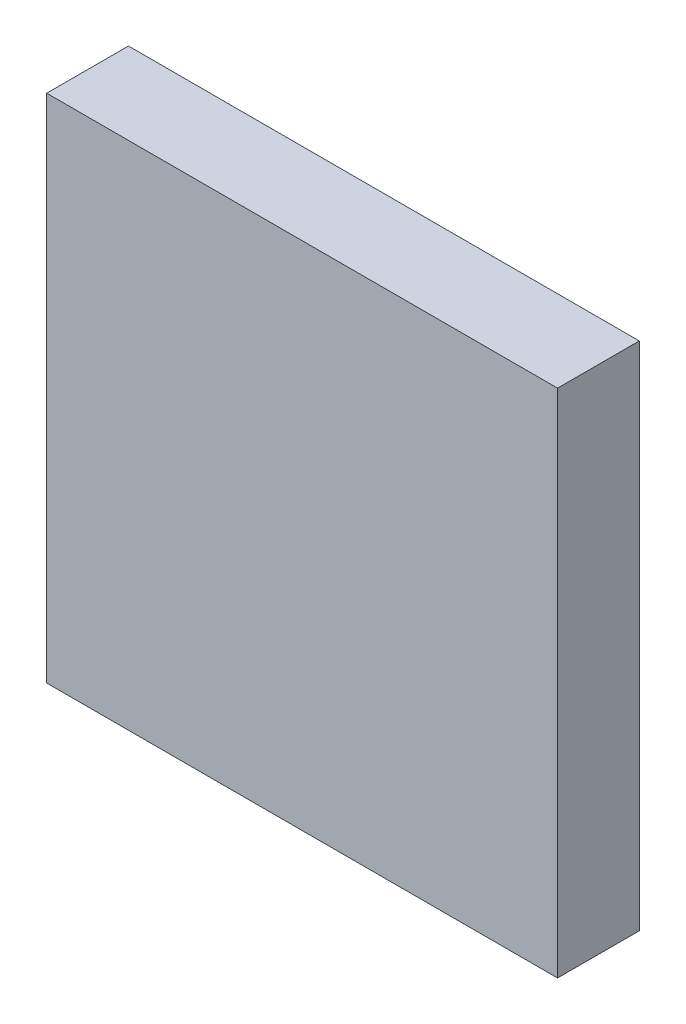
ISO-10303-21;
HEADER;
FILE_DESCRIPTION(('STEP AP214'),'2;1');
FILE_NAME('part.step','',(''),(''),'','','');
FILE_SCHEMA(('AUTOMOTIVE_DESIGN { 1 0 10303 214 1 1 1 1 }'));
ENDSEC;
DATA;
#1=APPLICATION_CONTEXT('core data for automotive mechanical design processes');
#2=APPLICATION_PROTOCOL_DEFINITION('international standard','automotive_design',2000,#1);
#3=PRODUCT_CONTEXT('',#1,'mechanical');
#4=PRODUCT('Part','Part','',(#3));
#5=PRODUCT_RELATED_PRODUCT_CATEGORY('part','',(#4));
#6=PRODUCT_DEFINITION_FORMATION('','',#4);
#7=PRODUCT_DEFINITION_CONTEXT('part definition',#1,'design');
#8=PRODUCT_DEFINITION('design','',#6,#7);
#9=PRODUCT_DEFINITION_SHAPE('','',#8);
#10=(LENGTH_UNIT() NAMED_UNIT(*) SI_UNIT(.MILLI.,.METRE.));
#11=(NAMED_UNIT(*) PLANE_ANGLE_UNIT() SI_UNIT($,.RADIAN.));
#12=(NAMED_UNIT(*) SI_UNIT($,.STERADIAN.) SOLID_ANGLE_UNIT());
#13=UNCERTAINTY_MEASURE_WITH_UNIT(LENGTH_MEASURE(1.E-05),#10,'distance_accuracy_value','');
#14=(GEOMETRIC_REPRESENTATION_CONTEXT(3) GLOBAL_UNCERTAINTY_ASSIGNED_CONTEXT((#13)) GLOBAL_UNIT_ASSIGNED_CONTEXT((#10,
#11,#12)) REPRESENTATION_CONTEXT('',''));
#15=CARTESIAN_POINT('',(0.,0.,0.));
#16=DIRECTION('',(0.,0.,1.));
#17=DIRECTION('',(1.,0.,0.));
#18=AXIS2_PLACEMENT_3D('',#15,#16,#17);
#19=CARTESIAN_POINT('',(-12.5,12.5,4.));
#20=DIRECTION('',(1.,0.,0.));
#21=DIRECTION('',(0.,0.,-1.));
#22=AXIS2_PLACEMENT_3D('',#19,#20,#21);
#23=PLANE('',#22);
#24=DIRECTION('',(0.,-1.,0.));
#25=VECTOR('',#24,1.);
#26=CARTESIAN_POINT('',(-12.5,12.5,0.));
#27=LINE('',#26,#25);
#28=CARTESIAN_POINT('',(-12.5,12.5,0.));
#29=VERTEX_POINT('',#28);
#30=CARTESIAN_POINT('',(-12.5,-12.5,0.));
#31=VERTEX_POINT('',#30);
#32=EDGE_CURVE('E100',#29,#31,#27,.T.);
#33=ORIENTED_EDGE('',*,*,#32,.T.);
#34=DIRECTION('',(0.,0.,-1.));
#35=VECTOR('',#34,1.);
#36=CARTESIAN_POINT('',(-12.5,-12.5,4.));
#37=LINE('',#36,#35);
#38=CARTESIAN_POINT('',(-12.5,-12.5,4.));
#39=VERTEX_POINT('',#38);
#40=EDGE_CURVE('E11',#39,#31,#37,.T.);
#41=ORIENTED_EDGE('',*,*,#40,.F.);
#42=DIRECTION('',(0.,-1.,0.));
#43=VECTOR('',#42,1.);
#44=CARTESIAN_POINT('',(-12.5,12.5,4.));
#45=LINE('',#44,#43);
#46=CARTESIAN_POINT('',(-12.5,12.5,4.));
#47=VERTEX_POINT('',#46);
#48=EDGE_CURVE('E88',#47,#39,#45,.T.);
#49=ORIENTED_EDGE('',*,*,#48,.F.);
#50=DIRECTION('',(0.,0.,-1.));
#51=VECTOR('',#50,1.);
#52=CARTESIAN_POINT('',(-12.5,12.5,4.));
#53=LINE('',#52,#51);
#54=EDGE_CURVE('E96',#47,#29,#53,.T.);
#55=ORIENTED_EDGE('',*,*,#54,.T.);
#56=EDGE_LOOP('',(#33,#41,#49,#55));
#57=FACE_BOUND('',#56,.T.);
#58=ADVANCED_FACE('F37',(#57),#23,.F.);
#59=CARTESIAN_POINT('',(-12.5,-12.5,4.));
#60=DIRECTION('',(0.,1.,0.));
#61=DIRECTION('',(0.,0.,1.));
#62=AXIS2_PLACEMENT_3D('',#59,#60,#61);
#63=PLANE('',#62);
#64=DIRECTION('',(1.,0.,0.));
#65=VECTOR('',#64,1.);
#66=CARTESIAN_POINT('',(-12.5,-12.5,0.));
#67=LINE('',#66,#65);
#68=CARTESIAN_POINT('',(12.5,-12.5,0.));
#69=VERTEX_POINT('',#68);
#70=EDGE_CURVE('E92',#31,#69,#67,.T.);
#71=ORIENTED_EDGE('',*,*,#70,.T.);
#72=DIRECTION('',(0.,0.,-1.));
#73=VECTOR('',#72,1.);
#74=CARTESIAN_POINT('',(12.5,-12.5,4.));
#75=LINE('',#74,#73);
#76=CARTESIAN_POINT('',(12.5,-12.5,4.));
#77=VERTEX_POINT('',#76);
#78=EDGE_CURVE('E45',#77,#69,#75,.T.);
#79=ORIENTED_EDGE('',*,*,#78,.F.);
#80=DIRECTION('',(1.,0.,0.));
#81=VECTOR('',#80,1.);
#82=CARTESIAN_POINT('',(-12.5,-12.5,4.));
#83=LINE('',#82,#81);
#84=EDGE_CURVE('E83',#39,#77,#83,.T.);
#85=ORIENTED_EDGE('',*,*,#84,.F.);
#86=ORIENTED_EDGE('',*,*,#40,.T.);
#87=EDGE_LOOP('',(#71,#79,#85,#86));
#88=FACE_BOUND('',#87,.T.);
#89=ADVANCED_FACE('F91',(#88),#63,.F.);
#90=CARTESIAN_POINT('',(12.5,-12.5,4.));
#91=DIRECTION('',(-1.,0.,0.));
#92=DIRECTION('',(0.,0.,1.));
#93=AXIS2_PLACEMENT_3D('',#90,#91,#92);
#94=PLANE('',#93);
#95=DIRECTION('',(0.,1.,0.));
#96=VECTOR('',#95,1.);
#97=CARTESIAN_POINT('',(12.5,-12.5,0.));
#98=LINE('',#97,#96);
#99=CARTESIAN_POINT('',(12.5,12.5,0.));
#100=VERTEX_POINT('',#99);
#101=EDGE_CURVE('E70',#69,#100,#98,.T.);
#102=ORIENTED_EDGE('',*,*,#101,.T.);
#103=DIRECTION('',(0.,0.,-1.));
#104=VECTOR('',#103,1.);
#105=CARTESIAN_POINT('',(12.5,12.5,4.));
#106=LINE('',#105,#104);
#107=CARTESIAN_POINT('',(12.5,12.5,4.));
#108=VERTEX_POINT('',#107);
#109=EDGE_CURVE('E93',#108,#100,#106,.T.);
#110=ORIENTED_EDGE('',*,*,#109,.F.);
#111=DIRECTION('',(0.,1.,0.));
#112=VECTOR('',#111,1.);
#113=CARTESIAN_POINT('',(12.5,-12.5,4.));
#114=LINE('',#113,#112);
#115=EDGE_CURVE('E86',#77,#108,#114,.T.);
#116=ORIENTED_EDGE('',*,*,#115,.F.);
#117=ORIENTED_EDGE('',*,*,#78,.T.);
#118=EDGE_LOOP('',(#102,#110,#116,#117));
#119=FACE_BOUND('',#118,.T.);
#120=ADVANCED_FACE('F94',(#119),#94,.F.);
#121=CARTESIAN_POINT('',(12.5,12.5,4.));
#122=DIRECTION('',(0.,-1.,0.));
#123=DIRECTION('',(0.,0.,-1.));
#124=AXIS2_PLACEMENT_3D('',#121,#122,#123);
#125=PLANE('',#124);
#126=DIRECTION('',(-1.,0.,0.));
#127=VECTOR('',#126,1.);
#128=CARTESIAN_POINT('',(12.5,12.5,0.));
#129=LINE('',#128,#127);
#130=EDGE_CURVE('E76',#100,#29,#129,.T.);
#131=ORIENTED_EDGE('',*,*,#130,.T.);
#132=ORIENTED_EDGE('',*,*,#54,.F.);
#133=DIRECTION('',(-1.,0.,0.));
#134=VECTOR('',#133,1.);
#135=CARTESIAN_POINT('',(12.5,12.5,4.));
#136=LINE('',#135,#134);
#137=EDGE_CURVE('E53',#108,#47,#136,.T.);
#138=ORIENTED_EDGE('',*,*,#137,.F.);
#139=ORIENTED_EDGE('',*,*,#109,.T.);
#140=EDGE_LOOP('',(#131,#132,#138,#139));
#141=FACE_BOUND('',#140,.T.);
#142=ADVANCED_FACE('F107',(#141),#125,.F.);
#143=CARTESIAN_POINT('',(0.,0.,4.));
#144=DIRECTION('',(0.,0.,1.));
#145=DIRECTION('',(1.,0.,0.));
#146=AXIS2_PLACEMENT_3D('',#143,#144,#145);
#147=PLANE('',#146);
#148=ORIENTED_EDGE('',*,*,#48,.T.);
#149=ORIENTED_EDGE('',*,*,#84,.T.);
#150=ORIENTED_EDGE('',*,*,#115,.T.);
#151=ORIENTED_EDGE('',*,*,#137,.T.);
#152=EDGE_LOOP('',(#148,#149,#150,#151));
#153=FACE_BOUND('',#152,.T.);
#154=ADVANCED_FACE('F84',(#153),#147,.T.);
#155=CARTESIAN_POINT('',(0.,0.,0.));
#156=DIRECTION('',(0.,0.,1.));
#157=DIRECTION('',(1.,0.,0.));
#158=AXIS2_PLACEMENT_3D('',#155,#156,#157);
#159=PLANE('',#158);
#160=ORIENTED_EDGE('',*,*,#32,.F.);
#161=ORIENTED_EDGE('',*,*,#130,.F.);
#162=ORIENTED_EDGE('',*,*,#101,.F.);
#163=ORIENTED_EDGE('',*,*,#70,.F.);
#164=EDGE_LOOP('',(#160,#161,#162,#163));
#165=FACE_BOUND('',#164,.T.);
#166=ADVANCED_FACE('F110',(#165),#159,.F.);
#167=CLOSED_SHELL('',(#58,#89,#120,#142,#154,#166));
#168=MANIFOLD_SOLID_BREP('B2',#167);
#169=ADVANCED_BREP_SHAPE_REPRESENTATION('',(#18,#168),#14);
#170=SHAPE_DEFINITION_REPRESENTATION(#9,#169);
ENDSEC;
END-ISO-10303-21;
